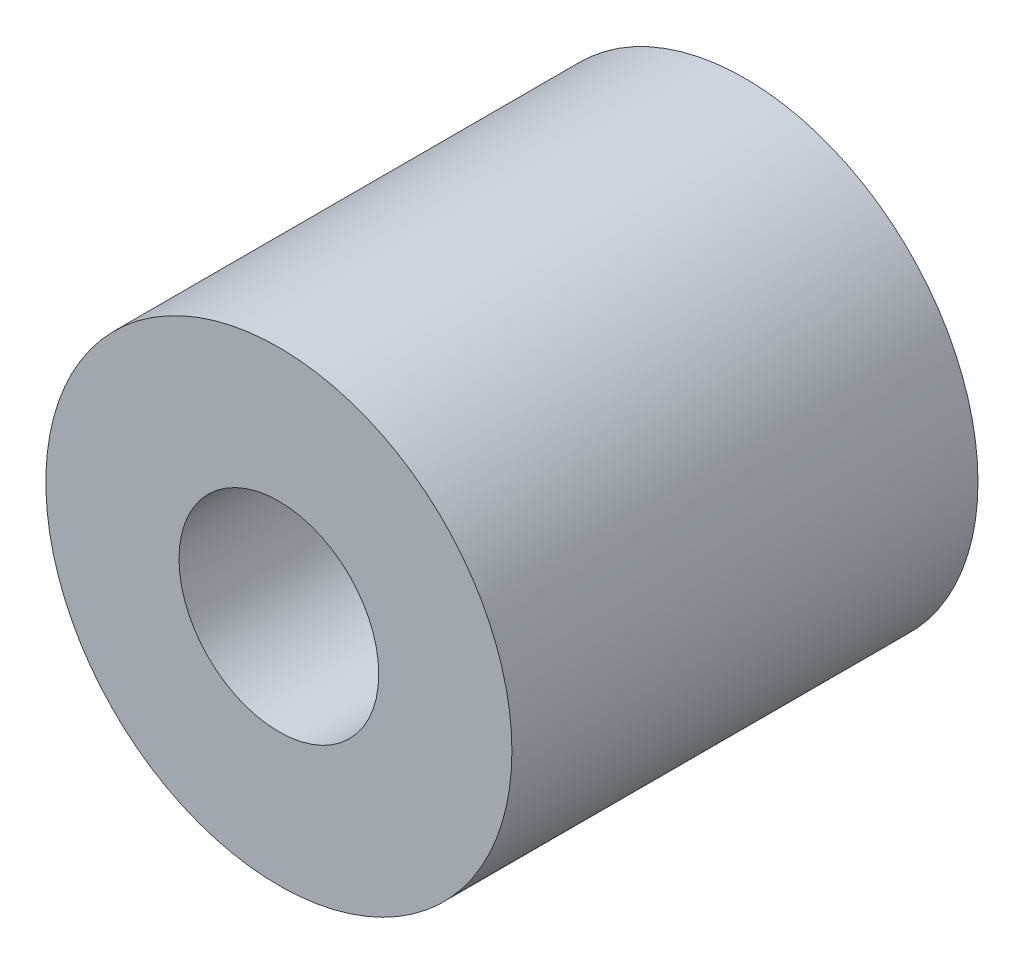
ISO-10303-21;
HEADER;
FILE_DESCRIPTION(('STEP AP214'),'2;1');
FILE_NAME('part.step','',(''),(''),'','','');
FILE_SCHEMA(('AUTOMOTIVE_DESIGN { 1 0 10303 214 1 1 1 1 }'));
ENDSEC;
DATA;
#1=APPLICATION_CONTEXT('core data for automotive mechanical design processes');
#2=APPLICATION_PROTOCOL_DEFINITION('international standard','automotive_design',2000,#1);
#3=PRODUCT_CONTEXT('',#1,'mechanical');
#4=PRODUCT('Part','Part','',(#3));
#5=PRODUCT_RELATED_PRODUCT_CATEGORY('part','',(#4));
#6=PRODUCT_DEFINITION_FORMATION('','',#4);
#7=PRODUCT_DEFINITION_CONTEXT('part definition',#1,'design');
#8=PRODUCT_DEFINITION('design','',#6,#7);
#9=PRODUCT_DEFINITION_SHAPE('','',#8);
#10=(LENGTH_UNIT() NAMED_UNIT(*) SI_UNIT(.MILLI.,.METRE.));
#11=(NAMED_UNIT(*) PLANE_ANGLE_UNIT() SI_UNIT($,.RADIAN.));
#12=(NAMED_UNIT(*) SI_UNIT($,.STERADIAN.) SOLID_ANGLE_UNIT());
#13=UNCERTAINTY_MEASURE_WITH_UNIT(LENGTH_MEASURE(1.E-05),#10,'distance_accuracy_value','');
#14=(GEOMETRIC_REPRESENTATION_CONTEXT(3) GLOBAL_UNCERTAINTY_ASSIGNED_CONTEXT((#13)) GLOBAL_UNIT_ASSIGNED_CONTEXT((#10,
#11,#12)) REPRESENTATION_CONTEXT('',''));
#15=CARTESIAN_POINT('',(0.,0.,0.));
#16=DIRECTION('',(0.,0.,1.));
#17=DIRECTION('',(1.,0.,0.));
#18=AXIS2_PLACEMENT_3D('',#15,#16,#17);
#19=CARTESIAN_POINT('',(0.,0.,7.));
#20=DIRECTION('',(0.,0.,1.));
#21=DIRECTION('',(1.,0.,0.));
#22=AXIS2_PLACEMENT_3D('',#19,#20,#21);
#23=PLANE('',#22);
#24=CARTESIAN_POINT('',(0.,0.,7.));
#25=DIRECTION('',(0.,0.,1.));
#26=DIRECTION('',(1.,0.,0.));
#27=AXIS2_PLACEMENT_3D('',#24,#25,#26);
#28=CIRCLE('',#27,3.5);
#29=CARTESIAN_POINT('',(3.5,0.,7.));
#30=VERTEX_POINT('',#29);
#31=EDGE_CURVE('E10',#30,#30,#28,.T.);
#32=ORIENTED_EDGE('',*,*,#31,.T.);
#33=EDGE_LOOP('',(#32));
#34=FACE_BOUND('',#33,.T.);
#35=CARTESIAN_POINT('',(0.,0.,7.));
#36=DIRECTION('',(0.,0.,1.));
#37=DIRECTION('',(1.,0.,0.));
#38=AXIS2_PLACEMENT_3D('',#35,#36,#37);
#39=CIRCLE('',#38,1.5);
#40=CARTESIAN_POINT('',(1.5,0.,7.));
#41=VERTEX_POINT('',#40);
#42=EDGE_CURVE('E43',#41,#41,#39,.T.);
#43=ORIENTED_EDGE('',*,*,#42,.F.);
#44=EDGE_LOOP('',(#43));
#45=FACE_BOUND('',#44,.T.);
#46=ADVANCED_FACE('F32',(#34,#45),#23,.T.);
#47=CARTESIAN_POINT('',(0.,0.,0.));
#48=DIRECTION('',(0.,0.,1.));
#49=DIRECTION('',(1.,0.,0.));
#50=AXIS2_PLACEMENT_3D('',#47,#48,#49);
#51=PLANE('',#50);
#52=CARTESIAN_POINT('',(0.,0.,0.));
#53=DIRECTION('',(0.,0.,1.));
#54=DIRECTION('',(1.,0.,0.));
#55=AXIS2_PLACEMENT_3D('',#52,#53,#54);
#56=CIRCLE('',#55,3.5);
#57=CARTESIAN_POINT('',(3.5,0.,0.));
#58=VERTEX_POINT('',#57);
#59=EDGE_CURVE('E36',#58,#58,#56,.T.);
#60=ORIENTED_EDGE('',*,*,#59,.F.);
#61=EDGE_LOOP('',(#60));
#62=FACE_BOUND('',#61,.T.);
#63=CARTESIAN_POINT('',(0.,0.,0.));
#64=DIRECTION('',(0.,0.,1.));
#65=DIRECTION('',(1.,0.,0.));
#66=AXIS2_PLACEMENT_3D('',#63,#64,#65);
#67=CIRCLE('',#66,1.5);
#68=CARTESIAN_POINT('',(1.5,0.,0.));
#69=VERTEX_POINT('',#68);
#70=EDGE_CURVE('E45',#69,#69,#67,.T.);
#71=ORIENTED_EDGE('',*,*,#70,.T.);
#72=EDGE_LOOP('',(#71));
#73=FACE_BOUND('',#72,.T.);
#74=ADVANCED_FACE('F55',(#62,#73),#51,.F.);
#75=CARTESIAN_POINT('',(0.,0.,7.));
#76=DIRECTION('',(0.,0.,-1.));
#77=DIRECTION('',(-1.,0.,0.));
#78=AXIS2_PLACEMENT_3D('',#75,#76,#77);
#79=CYLINDRICAL_SURFACE('',#78,3.5);
#80=ORIENTED_EDGE('',*,*,#31,.F.);
#81=EDGE_LOOP('',(#80));
#82=FACE_BOUND('',#81,.T.);
#83=ORIENTED_EDGE('',*,*,#59,.T.);
#84=EDGE_LOOP('',(#83));
#85=FACE_BOUND('',#84,.T.);
#86=ADVANCED_FACE('F34',(#82,#85),#79,.T.);
#87=CARTESIAN_POINT('',(0.,0.,7.));
#88=DIRECTION('',(0.,0.,-1.));
#89=DIRECTION('',(-1.,0.,0.));
#90=AXIS2_PLACEMENT_3D('',#87,#88,#89);
#91=CYLINDRICAL_SURFACE('',#90,1.5);
#92=ORIENTED_EDGE('',*,*,#42,.T.);
#93=EDGE_LOOP('',(#92));
#94=FACE_BOUND('',#93,.T.);
#95=ORIENTED_EDGE('',*,*,#70,.F.);
#96=EDGE_LOOP('',(#95));
#97=FACE_BOUND('',#96,.T.);
#98=ADVANCED_FACE('F51',(#94,#97),#91,.F.);
#99=CLOSED_SHELL('',(#46,#74,#86,#98));
#100=MANIFOLD_SOLID_BREP('B2',#99);
#101=ADVANCED_BREP_SHAPE_REPRESENTATION('',(#18,#100),#14);
#102=SHAPE_DEFINITION_REPRESENTATION(#9,#101);
ENDSEC;
END-ISO-10303-21;
